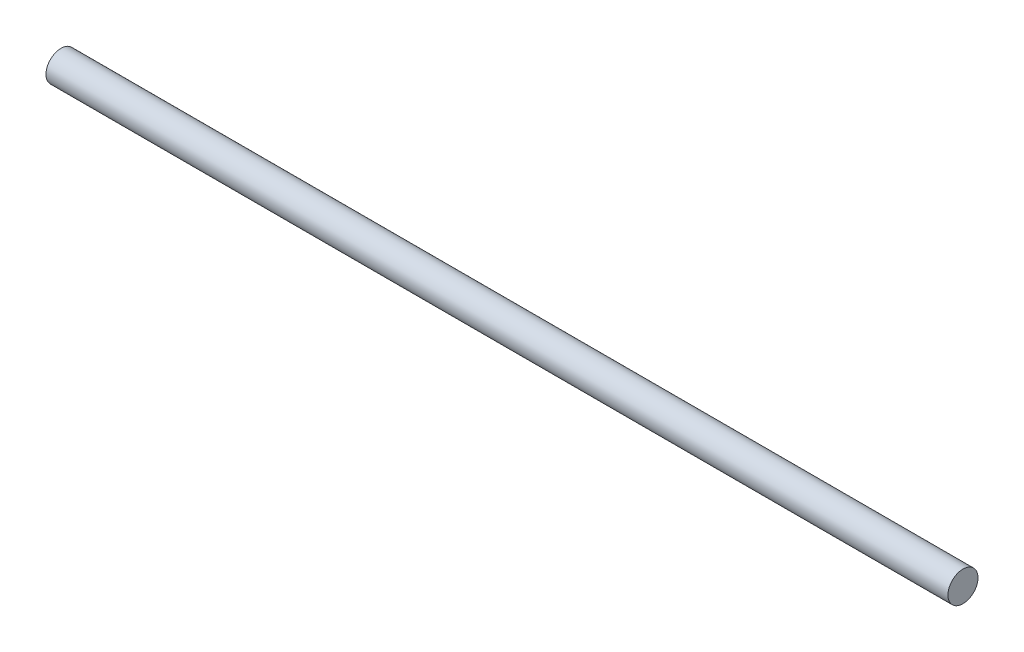
ISO-10303-21;
HEADER;
FILE_DESCRIPTION(('STEP AP214'),'2;1');
FILE_NAME('part.step','',(''),(''),'','','');
FILE_SCHEMA(('AUTOMOTIVE_DESIGN { 1 0 10303 214 1 1 1 1 }'));
ENDSEC;
DATA;
#1=APPLICATION_CONTEXT('core data for automotive mechanical design processes');
#2=APPLICATION_PROTOCOL_DEFINITION('international standard','automotive_design',2000,#1);
#3=PRODUCT_CONTEXT('',#1,'mechanical');
#4=PRODUCT('Part','Part','',(#3));
#5=PRODUCT_RELATED_PRODUCT_CATEGORY('part','',(#4));
#6=PRODUCT_DEFINITION_FORMATION('','',#4);
#7=PRODUCT_DEFINITION_CONTEXT('part definition',#1,'design');
#8=PRODUCT_DEFINITION('design','',#6,#7);
#9=PRODUCT_DEFINITION_SHAPE('','',#8);
#10=(LENGTH_UNIT() NAMED_UNIT(*) SI_UNIT(.MILLI.,.METRE.));
#11=(NAMED_UNIT(*) PLANE_ANGLE_UNIT() SI_UNIT($,.RADIAN.));
#12=(NAMED_UNIT(*) SI_UNIT($,.STERADIAN.) SOLID_ANGLE_UNIT());
#13=UNCERTAINTY_MEASURE_WITH_UNIT(LENGTH_MEASURE(1.E-05),#10,'distance_accuracy_value','');
#14=(GEOMETRIC_REPRESENTATION_CONTEXT(3) GLOBAL_UNCERTAINTY_ASSIGNED_CONTEXT((#13)) GLOBAL_UNIT_ASSIGNED_CONTEXT((#10,
#11,#12)) REPRESENTATION_CONTEXT('',''));
#15=CARTESIAN_POINT('',(0.,0.,0.));
#16=DIRECTION('',(0.,0.,1.));
#17=DIRECTION('',(1.,0.,0.));
#18=AXIS2_PLACEMENT_3D('',#15,#16,#17);
#19=CARTESIAN_POINT('',(600.,0.,0.));
#20=DIRECTION('',(-1.,0.,0.));
#21=DIRECTION('',(0.,0.,1.));
#22=AXIS2_PLACEMENT_3D('',#19,#20,#21);
#23=CYLINDRICAL_SURFACE('',#22,10.);
#24=CARTESIAN_POINT('',(600.,0.,0.));
#25=DIRECTION('',(1.,0.,0.));
#26=DIRECTION('',(0.,0.,-1.));
#27=AXIS2_PLACEMENT_3D('',#24,#25,#26);
#28=CIRCLE('',#27,10.);
#29=CARTESIAN_POINT('',(600.,0.,-10.));
#30=VERTEX_POINT('',#29);
#31=EDGE_CURVE('E10',#30,#30,#28,.T.);
#32=ORIENTED_EDGE('',*,*,#31,.F.);
#33=EDGE_LOOP('',(#32));
#34=FACE_BOUND('',#33,.T.);
#35=CARTESIAN_POINT('',(0.,0.,0.));
#36=DIRECTION('',(1.,0.,0.));
#37=DIRECTION('',(0.,0.,-1.));
#38=AXIS2_PLACEMENT_3D('',#35,#36,#37);
#39=CIRCLE('',#38,10.);
#40=CARTESIAN_POINT('',(0.,0.,-10.));
#41=VERTEX_POINT('',#40);
#42=EDGE_CURVE('E42',#41,#41,#39,.T.);
#43=ORIENTED_EDGE('',*,*,#42,.T.);
#44=EDGE_LOOP('',(#43));
#45=FACE_BOUND('',#44,.T.);
#46=ADVANCED_FACE('F41',(#34,#45),#23,.T.);
#47=CARTESIAN_POINT('',(600.,0.,0.));
#48=DIRECTION('',(1.,0.,0.));
#49=DIRECTION('',(0.,0.,-1.));
#50=AXIS2_PLACEMENT_3D('',#47,#48,#49);
#51=PLANE('',#50);
#52=ORIENTED_EDGE('',*,*,#31,.T.);
#53=EDGE_LOOP('',(#52));
#54=FACE_BOUND('',#53,.T.);
#55=ADVANCED_FACE('F57',(#54),#51,.T.);
#56=CARTESIAN_POINT('',(0.,0.,0.));
#57=DIRECTION('',(1.,0.,0.));
#58=DIRECTION('',(0.,0.,-1.));
#59=AXIS2_PLACEMENT_3D('',#56,#57,#58);
#60=PLANE('',#59);
#61=ORIENTED_EDGE('',*,*,#42,.F.);
#62=EDGE_LOOP('',(#61));
#63=FACE_BOUND('',#62,.T.);
#64=ADVANCED_FACE('F53',(#63),#60,.F.);
#65=CLOSED_SHELL('',(#46,#55,#64));
#66=MANIFOLD_SOLID_BREP('B2',#65);
#67=ADVANCED_BREP_SHAPE_REPRESENTATION('',(#18,#66),#14);
#68=SHAPE_DEFINITION_REPRESENTATION(#9,#67);
ENDSEC;
END-ISO-10303-21;
